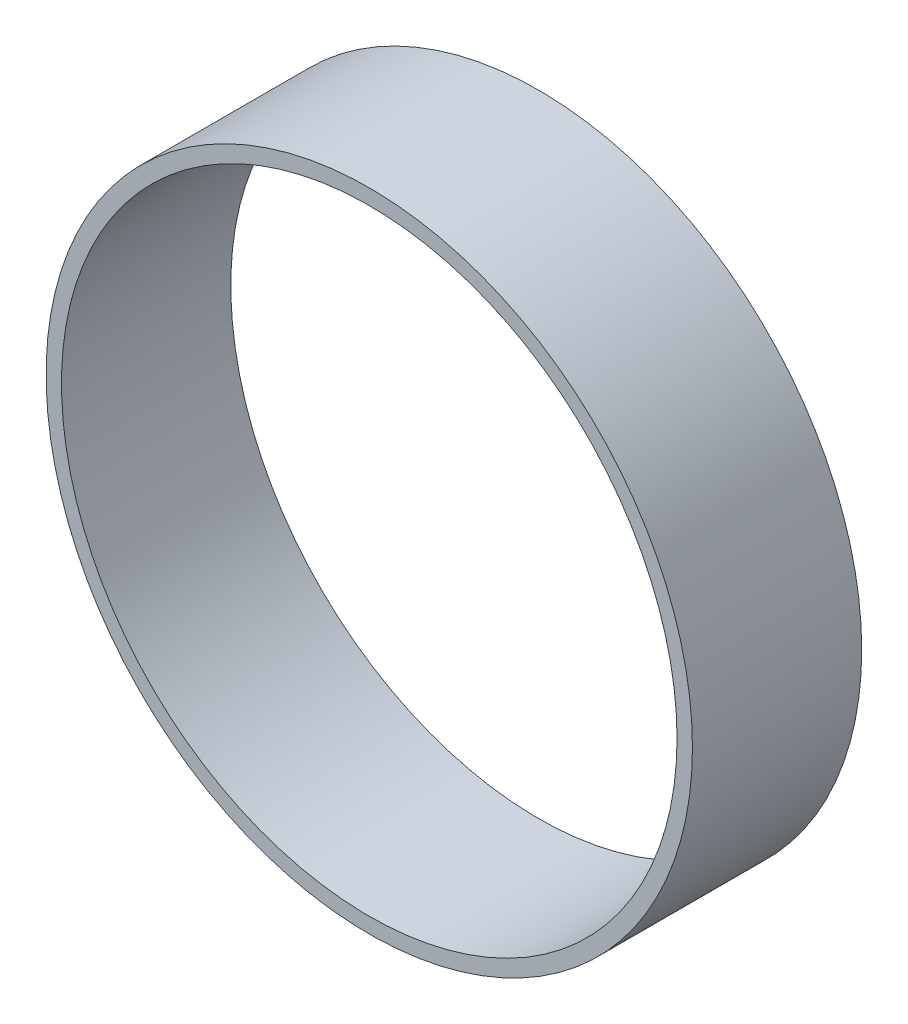
ISO-10303-21;
HEADER;
FILE_DESCRIPTION(('STEP AP214'),'2;1');
FILE_NAME('part.step','',(''),(''),'','','');
FILE_SCHEMA(('AUTOMOTIVE_DESIGN { 1 0 10303 214 1 1 1 1 }'));
ENDSEC;
DATA;
#1=APPLICATION_CONTEXT('core data for automotive mechanical design processes');
#2=APPLICATION_PROTOCOL_DEFINITION('international standard','automotive_design',2000,#1);
#3=PRODUCT_CONTEXT('',#1,'mechanical');
#4=PRODUCT('Part','Part','',(#3));
#5=PRODUCT_RELATED_PRODUCT_CATEGORY('part','',(#4));
#6=PRODUCT_DEFINITION_FORMATION('','',#4);
#7=PRODUCT_DEFINITION_CONTEXT('part definition',#1,'design');
#8=PRODUCT_DEFINITION('design','',#6,#7);
#9=PRODUCT_DEFINITION_SHAPE('','',#8);
#10=(LENGTH_UNIT() NAMED_UNIT(*) SI_UNIT(.MILLI.,.METRE.));
#11=(NAMED_UNIT(*) PLANE_ANGLE_UNIT() SI_UNIT($,.RADIAN.));
#12=(NAMED_UNIT(*) SI_UNIT($,.STERADIAN.) SOLID_ANGLE_UNIT());
#13=UNCERTAINTY_MEASURE_WITH_UNIT(LENGTH_MEASURE(1.E-05),#10,'distance_accuracy_value','');
#14=(GEOMETRIC_REPRESENTATION_CONTEXT(3) GLOBAL_UNCERTAINTY_ASSIGNED_CONTEXT((#13)) GLOBAL_UNIT_ASSIGNED_CONTEXT((#10,
#11,#12)) REPRESENTATION_CONTEXT('',''));
#15=CARTESIAN_POINT('',(0.,0.,0.));
#16=DIRECTION('',(0.,0.,1.));
#17=DIRECTION('',(1.,0.,0.));
#18=AXIS2_PLACEMENT_3D('',#15,#16,#17);
#19=CARTESIAN_POINT('',(0.,0.,11.));
#20=DIRECTION('',(0.,0.,-1.));
#21=DIRECTION('',(-1.,0.,0.));
#22=AXIS2_PLACEMENT_3D('',#19,#20,#21);
#23=CYLINDRICAL_SURFACE('',#22,21.);
#24=CARTESIAN_POINT('',(0.,0.,11.));
#25=DIRECTION('',(0.,0.,1.));
#26=DIRECTION('',(1.,0.,0.));
#27=AXIS2_PLACEMENT_3D('',#24,#25,#26);
#28=CIRCLE('',#27,21.);
#29=CARTESIAN_POINT('',(21.,0.,11.));
#30=VERTEX_POINT('',#29);
#31=EDGE_CURVE('E23',#30,#30,#28,.T.);
#32=ORIENTED_EDGE('',*,*,#31,.F.);
#33=EDGE_LOOP('',(#32));
#34=FACE_BOUND('',#33,.T.);
#35=CARTESIAN_POINT('',(0.,0.,0.));
#36=DIRECTION('',(0.,0.,1.));
#37=DIRECTION('',(1.,0.,0.));
#38=AXIS2_PLACEMENT_3D('',#35,#36,#37);
#39=CIRCLE('',#38,21.);
#40=CARTESIAN_POINT('',(21.,0.,0.));
#41=VERTEX_POINT('',#40);
#42=EDGE_CURVE('E33',#41,#41,#39,.T.);
#43=ORIENTED_EDGE('',*,*,#42,.T.);
#44=EDGE_LOOP('',(#43));
#45=FACE_BOUND('',#44,.T.);
#46=ADVANCED_FACE('F15',(#34,#45),#23,.T.);
#47=CARTESIAN_POINT('',(0.,0.,11.));
#48=DIRECTION('',(0.,0.,-1.));
#49=DIRECTION('',(-1.,0.,0.));
#50=AXIS2_PLACEMENT_3D('',#47,#48,#49);
#51=CYLINDRICAL_SURFACE('',#50,20.);
#52=CARTESIAN_POINT('',(0.,0.,11.));
#53=DIRECTION('',(0.,0.,1.));
#54=DIRECTION('',(1.,0.,0.));
#55=AXIS2_PLACEMENT_3D('',#52,#53,#54);
#56=CIRCLE('',#55,20.);
#57=CARTESIAN_POINT('',(20.,0.,11.));
#58=VERTEX_POINT('',#57);
#59=EDGE_CURVE('E10',#58,#58,#56,.T.);
#60=ORIENTED_EDGE('',*,*,#59,.T.);
#61=EDGE_LOOP('',(#60));
#62=FACE_BOUND('',#61,.T.);
#63=CARTESIAN_POINT('',(0.,0.,0.));
#64=DIRECTION('',(0.,0.,1.));
#65=DIRECTION('',(1.,0.,0.));
#66=AXIS2_PLACEMENT_3D('',#63,#64,#65);
#67=CIRCLE('',#66,20.);
#68=CARTESIAN_POINT('',(20.,0.,0.));
#69=VERTEX_POINT('',#68);
#70=EDGE_CURVE('E18',#69,#69,#67,.T.);
#71=ORIENTED_EDGE('',*,*,#70,.F.);
#72=EDGE_LOOP('',(#71));
#73=FACE_BOUND('',#72,.T.);
#74=ADVANCED_FACE('F45',(#62,#73),#51,.F.);
#75=CARTESIAN_POINT('',(0.,0.,11.));
#76=DIRECTION('',(0.,0.,1.));
#77=DIRECTION('',(1.,0.,0.));
#78=AXIS2_PLACEMENT_3D('',#75,#76,#77);
#79=PLANE('',#78);
#80=ORIENTED_EDGE('',*,*,#31,.T.);
#81=EDGE_LOOP('',(#80));
#82=FACE_BOUND('',#81,.T.);
#83=ORIENTED_EDGE('',*,*,#59,.F.);
#84=EDGE_LOOP('',(#83));
#85=FACE_BOUND('',#84,.T.);
#86=ADVANCED_FACE('F47',(#82,#85),#79,.T.);
#87=CARTESIAN_POINT('',(0.,0.,0.));
#88=DIRECTION('',(0.,0.,1.));
#89=DIRECTION('',(1.,0.,0.));
#90=AXIS2_PLACEMENT_3D('',#87,#88,#89);
#91=PLANE('',#90);
#92=ORIENTED_EDGE('',*,*,#42,.F.);
#93=EDGE_LOOP('',(#92));
#94=FACE_BOUND('',#93,.T.);
#95=ORIENTED_EDGE('',*,*,#70,.T.);
#96=EDGE_LOOP('',(#95));
#97=FACE_BOUND('',#96,.T.);
#98=ADVANCED_FACE('F43',(#94,#97),#91,.F.);
#99=CLOSED_SHELL('',(#46,#74,#86,#98));
#100=MANIFOLD_SOLID_BREP('B1',#99);
#101=ADVANCED_BREP_SHAPE_REPRESENTATION('',(#18,#100),#14);
#102=SHAPE_DEFINITION_REPRESENTATION(#9,#101);
ENDSEC;
END-ISO-10303-21;
